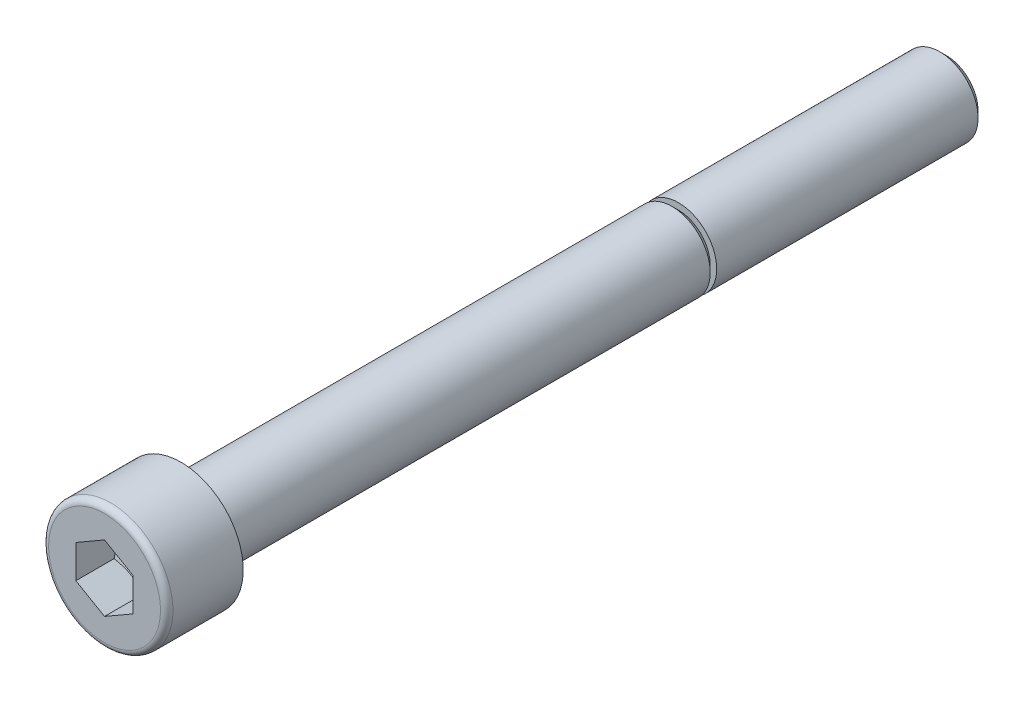
ISO-10303-21;
HEADER;
FILE_DESCRIPTION(('STEP AP214'),'2;1');
FILE_NAME('part.step','',(''),(''),'','','');
FILE_SCHEMA(('AUTOMOTIVE_DESIGN { 1 0 10303 214 1 1 1 1 }'));
ENDSEC;
DATA;
#1=APPLICATION_CONTEXT('core data for automotive mechanical design processes');
#2=APPLICATION_PROTOCOL_DEFINITION('international standard','automotive_design',2000,#1);
#3=PRODUCT_CONTEXT('',#1,'mechanical');
#4=PRODUCT('Part','Part','',(#3));
#5=PRODUCT_RELATED_PRODUCT_CATEGORY('part','',(#4));
#6=PRODUCT_DEFINITION_FORMATION('','',#4);
#7=PRODUCT_DEFINITION_CONTEXT('part definition',#1,'design');
#8=PRODUCT_DEFINITION('design','',#6,#7);
#9=PRODUCT_DEFINITION_SHAPE('','',#8);
#10=(LENGTH_UNIT() NAMED_UNIT(*) SI_UNIT(.MILLI.,.METRE.));
#11=(NAMED_UNIT(*) PLANE_ANGLE_UNIT() SI_UNIT($,.RADIAN.));
#12=(NAMED_UNIT(*) SI_UNIT($,.STERADIAN.) SOLID_ANGLE_UNIT());
#13=UNCERTAINTY_MEASURE_WITH_UNIT(LENGTH_MEASURE(1.E-05),#10,'distance_accuracy_value','');
#14=(GEOMETRIC_REPRESENTATION_CONTEXT(3) GLOBAL_UNCERTAINTY_ASSIGNED_CONTEXT((#13)) GLOBAL_UNIT_ASSIGNED_CONTEXT((#10,
#11,#12)) REPRESENTATION_CONTEXT('',''));
#15=CARTESIAN_POINT('',(0.,0.,0.));
#16=DIRECTION('',(0.,0.,1.));
#17=DIRECTION('',(1.,0.,0.));
#18=AXIS2_PLACEMENT_3D('',#15,#16,#17);
#19=CARTESIAN_POINT('',(-3.25,0.,0.));
#20=DIRECTION('',(0.,0.,-1.));
#21=DIRECTION('',(-1.,0.,0.));
#22=AXIS2_PLACEMENT_3D('',#19,#20,#21);
#23=PLANE('',#22);
#24=CARTESIAN_POINT('',(0.,0.,0.));
#25=DIRECTION('',(0.,0.,-1.));
#26=DIRECTION('',(-1.,0.,0.));
#27=AXIS2_PLACEMENT_3D('',#24,#25,#26);
#28=CIRCLE('',#27,6.5);
#29=CARTESIAN_POINT('',(-6.5,0.,0.));
#30=VERTEX_POINT('',#29);
#31=EDGE_CURVE('E9',#30,#30,#28,.T.);
#32=ORIENTED_EDGE('',*,*,#31,.T.);
#33=EDGE_LOOP('',(#32));
#34=FACE_BOUND('',#33,.T.);
#35=CARTESIAN_POINT('',(0.,0.,0.));
#36=DIRECTION('',(0.,0.,1.));
#37=DIRECTION('',(-1.,0.,0.));
#38=AXIS2_PLACEMENT_3D('',#35,#36,#37);
#39=CIRCLE('',#38,4.);
#40=CARTESIAN_POINT('',(4.,0.,0.));
#41=VERTEX_POINT('',#40);
#42=EDGE_CURVE('E131',#41,#41,#39,.T.);
#43=ORIENTED_EDGE('',*,*,#42,.T.);
#44=EDGE_LOOP('',(#43));
#45=FACE_BOUND('',#44,.T.);
#46=ADVANCED_FACE('F15',(#34,#45),#23,.T.);
#47=CARTESIAN_POINT('',(0.,0.,3.675));
#48=DIRECTION('',(0.,0.,1.));
#49=DIRECTION('',(-1.,0.,0.));
#50=AXIS2_PLACEMENT_3D('',#47,#48,#49);
#51=CYLINDRICAL_SURFACE('',#50,6.5);
#52=CARTESIAN_POINT('',(0.,0.,7.35));
#53=DIRECTION('',(0.,0.,-1.));
#54=DIRECTION('',(-1.,0.,0.));
#55=AXIS2_PLACEMENT_3D('',#52,#53,#54);
#56=CIRCLE('',#55,6.5);
#57=CARTESIAN_POINT('',(-6.5,0.,7.35));
#58=VERTEX_POINT('',#57);
#59=EDGE_CURVE('E25',#58,#58,#56,.T.);
#60=ORIENTED_EDGE('',*,*,#59,.T.);
#61=EDGE_LOOP('',(#60));
#62=FACE_BOUND('',#61,.T.);
#63=ORIENTED_EDGE('',*,*,#31,.F.);
#64=EDGE_LOOP('',(#63));
#65=FACE_BOUND('',#64,.T.);
#66=ADVANCED_FACE('F223',(#62,#65),#51,.T.);
#67=CARTESIAN_POINT('',(0.,0.,7.35));
#68=DIRECTION('',(0.,0.,-1.));
#69=DIRECTION('',(0.,-1.,0.));
#70=AXIS2_PLACEMENT_3D('',#67,#68,#69);
#71=TOROIDAL_SURFACE('',#70,5.85,0.65);
#72=CARTESIAN_POINT('',(0.,0.,8.));
#73=DIRECTION('',(0.,0.,-1.));
#74=DIRECTION('',(-1.,0.,0.));
#75=AXIS2_PLACEMENT_3D('',#72,#73,#74);
#76=CIRCLE('',#75,5.85);
#77=CARTESIAN_POINT('',(-5.85,0.,8.));
#78=VERTEX_POINT('',#77);
#79=EDGE_CURVE('E134',#78,#78,#76,.T.);
#80=ORIENTED_EDGE('',*,*,#79,.T.);
#81=EDGE_LOOP('',(#80));
#82=FACE_BOUND('',#81,.T.);
#83=ORIENTED_EDGE('',*,*,#59,.F.);
#84=EDGE_LOOP('',(#83));
#85=FACE_BOUND('',#84,.T.);
#86=ADVANCED_FACE('F228',(#82,#85),#71,.T.);
#87=CARTESIAN_POINT('',(-2.925,0.,8.));
#88=DIRECTION('',(0.,0.,1.));
#89=DIRECTION('',(1.,0.,0.));
#90=AXIS2_PLACEMENT_3D('',#87,#88,#89);
#91=PLANE('',#90);
#92=ORIENTED_EDGE('',*,*,#79,.F.);
#93=EDGE_LOOP('',(#92));
#94=FACE_BOUND('',#93,.T.);
#95=DIRECTION('',(-0.866025403784439,-0.5,0.));
#96=VECTOR('',#95,1.);
#97=CARTESIAN_POINT('',(0.403124300624837,-3.23135607651737,8.));
#98=LINE('',#97,#96);
#99=CARTESIAN_POINT('',(2.99999860124967,-1.73205,8.));
#100=VERTEX_POINT('',#99);
#101=CARTESIAN_POINT('',(0.,-3.4641,8.));
#102=VERTEX_POINT('',#101);
#103=EDGE_CURVE('E186',#100,#102,#98,.T.);
#104=ORIENTED_EDGE('',*,*,#103,.T.);
#105=DIRECTION('',(-0.866025403784439,0.5,0.));
#106=VECTOR('',#105,1.);
#107=CARTESIAN_POINT('',(-2.59687430062483,-1.96479392348263,8.));
#108=LINE('',#107,#106);
#109=CARTESIAN_POINT('',(-2.99999860124967,-1.73205,8.));
#110=VERTEX_POINT('',#109);
#111=EDGE_CURVE('E55',#102,#110,#108,.T.);
#112=ORIENTED_EDGE('',*,*,#111,.T.);
#113=DIRECTION('',(0.,1.,0.));
#114=VECTOR('',#113,1.);
#115=CARTESIAN_POINT('',(-2.99999860124967,0.,8.));
#116=LINE('',#115,#114);
#117=CARTESIAN_POINT('',(-2.99999860124967,1.73205,8.));
#118=VERTEX_POINT('',#117);
#119=EDGE_CURVE('E105',#110,#118,#116,.T.);
#120=ORIENTED_EDGE('',*,*,#119,.T.);
#121=DIRECTION('',(0.866025403784439,0.5,0.));
#122=VECTOR('',#121,1.);
#123=CARTESIAN_POINT('',(-2.59687430062483,1.96479392348263,8.));
#124=LINE('',#123,#122);
#125=CARTESIAN_POINT('',(0.,3.4641,8.));
#126=VERTEX_POINT('',#125);
#127=EDGE_CURVE('E163',#118,#126,#124,.T.);
#128=ORIENTED_EDGE('',*,*,#127,.T.);
#129=DIRECTION('',(0.866025403784439,-0.5,0.));
#130=VECTOR('',#129,1.);
#131=CARTESIAN_POINT('',(0.403124300624837,3.23135607651737,8.));
#132=LINE('',#131,#130);
#133=CARTESIAN_POINT('',(2.99999860124967,1.73205,8.));
#134=VERTEX_POINT('',#133);
#135=EDGE_CURVE('E160',#126,#134,#132,.T.);
#136=ORIENTED_EDGE('',*,*,#135,.T.);
#137=DIRECTION('',(0.,-1.,0.));
#138=VECTOR('',#137,1.);
#139=CARTESIAN_POINT('',(2.99999860124967,0.,8.));
#140=LINE('',#139,#138);
#141=EDGE_CURVE('E44',#134,#100,#140,.T.);
#142=ORIENTED_EDGE('',*,*,#141,.T.);
#143=EDGE_LOOP('',(#104,#112,#120,#128,#136,#142));
#144=FACE_BOUND('',#143,.T.);
#145=ADVANCED_FACE('F200',(#94,#144),#91,.T.);
#146=CARTESIAN_POINT('',(-1.66171875,0.,-80.));
#147=DIRECTION('',(0.,0.,-1.));
#148=DIRECTION('',(-1.,0.,0.));
#149=AXIS2_PLACEMENT_3D('',#146,#147,#148);
#150=PLANE('',#149);
#151=CARTESIAN_POINT('',(0.,0.,-80.));
#152=DIRECTION('',(0.,0.,-1.));
#153=DIRECTION('',(-1.,0.,0.));
#154=AXIS2_PLACEMENT_3D('',#151,#152,#153);
#155=CIRCLE('',#154,3.3234375);
#156=CARTESIAN_POINT('',(-3.3234375,0.,-80.));
#157=VERTEX_POINT('',#156);
#158=EDGE_CURVE('E132',#157,#157,#155,.T.);
#159=ORIENTED_EDGE('',*,*,#158,.T.);
#160=EDGE_LOOP('',(#159));
#161=FACE_BOUND('',#160,.T.);
#162=ADVANCED_FACE('F246',(#161),#150,.T.);
#163=CARTESIAN_POINT('',(0.,0.,-79.66171875));
#164=DIRECTION('',(0.,0.,1.));
#165=DIRECTION('',(-1.,0.,0.));
#166=AXIS2_PLACEMENT_3D('',#163,#164,#165);
#167=CONICAL_SURFACE('',#166,3.66171875,0.785398163397446);
#168=CARTESIAN_POINT('',(0.,0.,-79.3234375));
#169=DIRECTION('',(0.,0.,-1.));
#170=DIRECTION('',(-1.,0.,0.));
#171=AXIS2_PLACEMENT_3D('',#168,#169,#170);
#172=CIRCLE('',#171,4.);
#173=CARTESIAN_POINT('',(-4.,0.,-79.3234375));
#174=VERTEX_POINT('',#173);
#175=EDGE_CURVE('E135',#174,#174,#172,.T.);
#176=ORIENTED_EDGE('',*,*,#175,.T.);
#177=EDGE_LOOP('',(#176));
#178=FACE_BOUND('',#177,.T.);
#179=ORIENTED_EDGE('',*,*,#158,.F.);
#180=EDGE_LOOP('',(#179));
#181=FACE_BOUND('',#180,.T.);
#182=ADVANCED_FACE('F243',(#178,#181),#167,.T.);
#183=CARTESIAN_POINT('',(0.,0.,-65.66171875));
#184=DIRECTION('',(0.,0.,1.));
#185=DIRECTION('',(-1.,0.,0.));
#186=AXIS2_PLACEMENT_3D('',#183,#184,#185);
#187=CYLINDRICAL_SURFACE('',#186,4.);
#188=CARTESIAN_POINT('',(0.,0.,-52.));
#189=DIRECTION('',(0.,0.,-1.));
#190=DIRECTION('',(-1.,0.,0.));
#191=AXIS2_PLACEMENT_3D('',#188,#189,#190);
#192=CIRCLE('',#191,4.);
#193=CARTESIAN_POINT('',(-4.,0.,-52.));
#194=VERTEX_POINT('',#193);
#195=EDGE_CURVE('E184',#194,#194,#192,.T.);
#196=ORIENTED_EDGE('',*,*,#195,.T.);
#197=EDGE_LOOP('',(#196));
#198=FACE_BOUND('',#197,.T.);
#199=ORIENTED_EDGE('',*,*,#175,.F.);
#200=EDGE_LOOP('',(#199));
#201=FACE_BOUND('',#200,.T.);
#202=ADVANCED_FACE('F17',(#198,#201),#187,.T.);
#203=CARTESIAN_POINT('',(-3.66171875,0.,-52.));
#204=DIRECTION('',(0.,0.,1.));
#205=DIRECTION('',(1.,0.,0.));
#206=AXIS2_PLACEMENT_3D('',#203,#204,#205);
#207=PLANE('',#206);
#208=CARTESIAN_POINT('',(0.,0.,-52.));
#209=DIRECTION('',(0.,0.,-1.));
#210=DIRECTION('',(-1.,0.,0.));
#211=AXIS2_PLACEMENT_3D('',#208,#209,#210);
#212=CIRCLE('',#211,3.3234375);
#213=CARTESIAN_POINT('',(-3.3234375,0.,-52.));
#214=VERTEX_POINT('',#213);
#215=EDGE_CURVE('E187',#214,#214,#212,.T.);
#216=ORIENTED_EDGE('',*,*,#215,.T.);
#217=EDGE_LOOP('',(#216));
#218=FACE_BOUND('',#217,.T.);
#219=ORIENTED_EDGE('',*,*,#195,.F.);
#220=EDGE_LOOP('',(#219));
#221=FACE_BOUND('',#220,.T.);
#222=ADVANCED_FACE('F233',(#218,#221),#207,.T.);
#223=CARTESIAN_POINT('',(0.,0.,-51.66171875));
#224=DIRECTION('',(0.,0.,1.));
#225=DIRECTION('',(-1.,0.,0.));
#226=AXIS2_PLACEMENT_3D('',#223,#224,#225);
#227=CONICAL_SURFACE('',#226,3.66171875,0.785398163397446);
#228=CARTESIAN_POINT('',(0.,0.,-51.3234375));
#229=DIRECTION('',(0.,0.,-1.));
#230=DIRECTION('',(-1.,0.,0.));
#231=AXIS2_PLACEMENT_3D('',#228,#229,#230);
#232=CIRCLE('',#231,4.);
#233=CARTESIAN_POINT('',(-4.,0.,-51.3234375));
#234=VERTEX_POINT('',#233);
#235=EDGE_CURVE('E126',#234,#234,#232,.T.);
#236=ORIENTED_EDGE('',*,*,#235,.T.);
#237=EDGE_LOOP('',(#236));
#238=FACE_BOUND('',#237,.T.);
#239=ORIENTED_EDGE('',*,*,#215,.F.);
#240=EDGE_LOOP('',(#239));
#241=FACE_BOUND('',#240,.T.);
#242=ADVANCED_FACE('F241',(#238,#241),#227,.T.);
#243=CARTESIAN_POINT('',(0.,0.,-25.16171875));
#244=DIRECTION('',(0.,0.,1.));
#245=DIRECTION('',(-1.,0.,0.));
#246=AXIS2_PLACEMENT_3D('',#243,#244,#245);
#247=CYLINDRICAL_SURFACE('',#246,4.);
#248=ORIENTED_EDGE('',*,*,#42,.F.);
#249=EDGE_LOOP('',(#248));
#250=FACE_BOUND('',#249,.T.);
#251=ORIENTED_EDGE('',*,*,#235,.F.);
#252=EDGE_LOOP('',(#251));
#253=FACE_BOUND('',#252,.T.);
#254=ADVANCED_FACE('F236',(#250,#253),#247,.T.);
#255=CARTESIAN_POINT('',(-1.49999930062484,-2.598075,8.));
#256=DIRECTION('',(-0.5,-0.866025403784439,0.));
#257=DIRECTION('',(-0.866025403784439,0.5,0.));
#258=AXIS2_PLACEMENT_3D('',#255,#256,#257);
#259=PLANE('',#258);
#260=CARTESIAN_POINT('',(0.,-3.4641,4.));
#261=CARTESIAN_POINT('',(-1.49999930062483,-2.598075,3.50000023312505));
#262=CARTESIAN_POINT('',(-2.99999860124967,-1.73205,4.));
#263=(BOUNDED_CURVE() B_SPLINE_CURVE(2,(#260,#261,#262),.UNSPECIFIED.,.F.,
.F.) B_SPLINE_CURVE_WITH_KNOTS((3,3),(0.,3.50530677988333),
.UNSPECIFIED.) CURVE() GEOMETRIC_REPRESENTATION_ITEM() RATIONAL_B_SPLINE_CURVE((1.,
1.15470053837925,1.)) REPRESENTATION_ITEM(''));
#264=CARTESIAN_POINT('',(0.,-3.4641,4.));
#265=VERTEX_POINT('',#264);
#266=CARTESIAN_POINT('',(-2.99999860124967,-1.73205,4.));
#267=VERTEX_POINT('',#266);
#268=EDGE_CURVE('E108',#265,#267,#263,.T.);
#269=ORIENTED_EDGE('',*,*,#268,.T.);
#270=DIRECTION('',(0.,0.,-1.));
#271=VECTOR('',#270,1.);
#272=CARTESIAN_POINT('',(-2.99999860124967,-1.73205,8.));
#273=LINE('',#272,#271);
#274=EDGE_CURVE('E98',#110,#267,#273,.T.);
#275=ORIENTED_EDGE('',*,*,#274,.F.);
#276=ORIENTED_EDGE('',*,*,#111,.F.);
#277=DIRECTION('',(0.,0.,-1.));
#278=VECTOR('',#277,1.);
#279=CARTESIAN_POINT('',(0.,-3.4641,8.));
#280=LINE('',#279,#278);
#281=EDGE_CURVE('E19',#102,#265,#280,.T.);
#282=ORIENTED_EDGE('',*,*,#281,.T.);
#283=EDGE_LOOP('',(#269,#275,#276,#282));
#284=FACE_BOUND('',#283,.T.);
#285=ADVANCED_FACE('F109',(#284),#259,.F.);
#286=CARTESIAN_POINT('',(-2.99999860124967,0.,8.));
#287=DIRECTION('',(-1.,0.,0.));
#288=DIRECTION('',(0.,1.,0.));
#289=AXIS2_PLACEMENT_3D('',#286,#287,#288);
#290=PLANE('',#289);
#291=CARTESIAN_POINT('',(-2.99999860124967,-1.73205,4.));
#292=CARTESIAN_POINT('',(-2.99999860124967,0.,3.50000023312505));
#293=CARTESIAN_POINT('',(-2.99999860124967,1.73205,4.));
#294=(BOUNDED_CURVE() B_SPLINE_CURVE(2,(#291,#292,#293),.UNSPECIFIED.,.F.,
.F.) B_SPLINE_CURVE_WITH_KNOTS((3,3),(0.,3.50530677988333),
.UNSPECIFIED.) CURVE() GEOMETRIC_REPRESENTATION_ITEM() RATIONAL_B_SPLINE_CURVE((1.,
1.15470053837925,1.)) REPRESENTATION_ITEM(''));
#295=CARTESIAN_POINT('',(-2.99999860124967,1.73205,4.));
#296=VERTEX_POINT('',#295);
#297=EDGE_CURVE('E103',#267,#296,#294,.T.);
#298=ORIENTED_EDGE('',*,*,#297,.T.);
#299=DIRECTION('',(0.,0.,-1.));
#300=VECTOR('',#299,1.);
#301=CARTESIAN_POINT('',(-2.99999860124967,1.73205,8.));
#302=LINE('',#301,#300);
#303=EDGE_CURVE('E165',#118,#296,#302,.T.);
#304=ORIENTED_EDGE('',*,*,#303,.F.);
#305=ORIENTED_EDGE('',*,*,#119,.F.);
#306=ORIENTED_EDGE('',*,*,#274,.T.);
#307=EDGE_LOOP('',(#298,#304,#305,#306));
#308=FACE_BOUND('',#307,.T.);
#309=ADVANCED_FACE('F100',(#308),#290,.F.);
#310=CARTESIAN_POINT('',(-1.49999930062484,2.598075,8.));
#311=DIRECTION('',(-0.5,0.866025403784439,0.));
#312=DIRECTION('',(0.866025403784439,0.5,0.));
#313=AXIS2_PLACEMENT_3D('',#310,#311,#312);
#314=PLANE('',#313);
#315=CARTESIAN_POINT('',(-2.99999860124967,1.73205,4.));
#316=CARTESIAN_POINT('',(-1.49999930062484,2.598075,3.50000023312506));
#317=CARTESIAN_POINT('',(0.,3.4641,4.));
#318=(BOUNDED_CURVE() B_SPLINE_CURVE(2,(#315,#316,#317),.UNSPECIFIED.,.F.,
.F.) B_SPLINE_CURVE_WITH_KNOTS((3,3),(0.,3.50530677988333),
.UNSPECIFIED.) CURVE() GEOMETRIC_REPRESENTATION_ITEM() RATIONAL_B_SPLINE_CURVE((1.,
1.15470053837925,1.)) REPRESENTATION_ITEM(''));
#319=CARTESIAN_POINT('',(0.,3.4641,4.));
#320=VERTEX_POINT('',#319);
#321=EDGE_CURVE('E119',#296,#320,#318,.T.);
#322=ORIENTED_EDGE('',*,*,#321,.T.);
#323=DIRECTION('',(0.,0.,-1.));
#324=VECTOR('',#323,1.);
#325=CARTESIAN_POINT('',(0.,3.4641,8.));
#326=LINE('',#325,#324);
#327=EDGE_CURVE('E161',#126,#320,#326,.T.);
#328=ORIENTED_EDGE('',*,*,#327,.F.);
#329=ORIENTED_EDGE('',*,*,#127,.F.);
#330=ORIENTED_EDGE('',*,*,#303,.T.);
#331=EDGE_LOOP('',(#322,#328,#329,#330));
#332=FACE_BOUND('',#331,.T.);
#333=ADVANCED_FACE('F212',(#332),#314,.F.);
#334=CARTESIAN_POINT('',(1.49999930062484,2.598075,8.));
#335=DIRECTION('',(0.5,0.866025403784439,0.));
#336=DIRECTION('',(0.866025403784439,-0.5,0.));
#337=AXIS2_PLACEMENT_3D('',#334,#335,#336);
#338=PLANE('',#337);
#339=CARTESIAN_POINT('',(0.,3.4641,4.));
#340=CARTESIAN_POINT('',(1.49999930062484,2.598075,3.50000023312505));
#341=CARTESIAN_POINT('',(2.99999860124967,1.73205,4.));
#342=(BOUNDED_CURVE() B_SPLINE_CURVE(2,(#339,#340,#341),.UNSPECIFIED.,.F.,
.F.) B_SPLINE_CURVE_WITH_KNOTS((3,3),(0.,3.50530677988332),
.UNSPECIFIED.) CURVE() GEOMETRIC_REPRESENTATION_ITEM() RATIONAL_B_SPLINE_CURVE((1.,
1.15470053837925,1.)) REPRESENTATION_ITEM(''));
#343=CARTESIAN_POINT('',(2.99999860124967,1.73205,4.));
#344=VERTEX_POINT('',#343);
#345=EDGE_CURVE('E141',#320,#344,#342,.T.);
#346=ORIENTED_EDGE('',*,*,#345,.T.);
#347=DIRECTION('',(0.,0.,-1.));
#348=VECTOR('',#347,1.);
#349=CARTESIAN_POINT('',(2.99999860124967,1.73205,8.));
#350=LINE('',#349,#348);
#351=EDGE_CURVE('E155',#134,#344,#350,.T.);
#352=ORIENTED_EDGE('',*,*,#351,.F.);
#353=ORIENTED_EDGE('',*,*,#135,.F.);
#354=ORIENTED_EDGE('',*,*,#327,.T.);
#355=EDGE_LOOP('',(#346,#352,#353,#354));
#356=FACE_BOUND('',#355,.T.);
#357=ADVANCED_FACE('F204',(#356),#338,.F.);
#358=CARTESIAN_POINT('',(2.99999860124967,0.,8.));
#359=DIRECTION('',(1.,0.,0.));
#360=DIRECTION('',(0.,-1.,0.));
#361=AXIS2_PLACEMENT_3D('',#358,#359,#360);
#362=PLANE('',#361);
#363=CARTESIAN_POINT('',(2.99999860124967,1.73205,4.));
#364=CARTESIAN_POINT('',(2.99999860124969,0.,3.50000023312506));
#365=CARTESIAN_POINT('',(2.99999860124967,-1.73205,4.));
#366=(BOUNDED_CURVE() B_SPLINE_CURVE(2,(#363,#364,#365),.UNSPECIFIED.,.F.,
.F.) B_SPLINE_CURVE_WITH_KNOTS((3,3),(0.,3.50530677988333),
.UNSPECIFIED.) CURVE() GEOMETRIC_REPRESENTATION_ITEM() RATIONAL_B_SPLINE_CURVE((1.,
1.15470053837924,1.)) REPRESENTATION_ITEM(''));
#367=CARTESIAN_POINT('',(2.99999860124967,-1.73205,4.));
#368=VERTEX_POINT('',#367);
#369=EDGE_CURVE('E136',#344,#368,#366,.T.);
#370=ORIENTED_EDGE('',*,*,#369,.T.);
#371=DIRECTION('',(0.,0.,-1.));
#372=VECTOR('',#371,1.);
#373=CARTESIAN_POINT('',(2.99999860124967,-1.73205,8.));
#374=LINE('',#373,#372);
#375=EDGE_CURVE('E185',#100,#368,#374,.T.);
#376=ORIENTED_EDGE('',*,*,#375,.F.);
#377=ORIENTED_EDGE('',*,*,#141,.F.);
#378=ORIENTED_EDGE('',*,*,#351,.T.);
#379=EDGE_LOOP('',(#370,#376,#377,#378));
#380=FACE_BOUND('',#379,.T.);
#381=ADVANCED_FACE('F207',(#380),#362,.F.);
#382=CARTESIAN_POINT('',(1.49999930062484,-2.598075,8.));
#383=DIRECTION('',(0.5,-0.866025403784439,0.));
#384=DIRECTION('',(-0.866025403784439,-0.5,0.));
#385=AXIS2_PLACEMENT_3D('',#382,#383,#384);
#386=PLANE('',#385);
#387=CARTESIAN_POINT('',(2.99999860124967,-1.73205,4.));
#388=CARTESIAN_POINT('',(1.49999930062485,-2.598075,3.50000023312506));
#389=CARTESIAN_POINT('',(0.,-3.4641,4.));
#390=(BOUNDED_CURVE() B_SPLINE_CURVE(2,(#387,#388,#389),.UNSPECIFIED.,.F.,
.F.) B_SPLINE_CURVE_WITH_KNOTS((3,3),(0.,3.50530677988333),
.UNSPECIFIED.) CURVE() GEOMETRIC_REPRESENTATION_ITEM() RATIONAL_B_SPLINE_CURVE((1.,
1.15470053837924,1.)) REPRESENTATION_ITEM(''));
#391=EDGE_CURVE('E114',#368,#265,#390,.T.);
#392=ORIENTED_EDGE('',*,*,#391,.T.);
#393=ORIENTED_EDGE('',*,*,#281,.F.);
#394=ORIENTED_EDGE('',*,*,#103,.F.);
#395=ORIENTED_EDGE('',*,*,#375,.T.);
#396=EDGE_LOOP('',(#392,#393,#394,#395));
#397=FACE_BOUND('',#396,.T.);
#398=ADVANCED_FACE('F210',(#397),#386,.F.);
#399=CARTESIAN_POINT('',(0.,0.,3.00000046625011));
#400=DIRECTION('',(0.,0.,1.));
#401=DIRECTION('',(-1.,0.,0.));
#402=AXIS2_PLACEMENT_3D('',#399,#400,#401);
#403=CONICAL_SURFACE('',#402,1.73205,1.0471975511966);
#404=CARTESIAN_POINT('',(0.,0.,2.00000093250022));
#405=VERTEX_POINT('',#404);
#406=VERTEX_LOOP('',#405);
#407=FACE_BOUND('',#406,.T.);
#408=ORIENTED_EDGE('',*,*,#321,.F.);
#409=ORIENTED_EDGE('',*,*,#297,.F.);
#410=ORIENTED_EDGE('',*,*,#268,.F.);
#411=ORIENTED_EDGE('',*,*,#391,.F.);
#412=ORIENTED_EDGE('',*,*,#369,.F.);
#413=ORIENTED_EDGE('',*,*,#345,.F.);
#414=EDGE_LOOP('',(#408,#409,#410,#411,#412,#413));
#415=FACE_BOUND('',#414,.T.);
#416=ADVANCED_FACE('F116',(#407,#415),#403,.F.);
#417=CLOSED_SHELL('',(#46,#66,#86,#145,#162,#182,#202,#222,#242,#254,#285,#309,#333,#357,#381,
#398,#416));
#418=MANIFOLD_SOLID_BREP('B1',#417);
#419=ADVANCED_BREP_SHAPE_REPRESENTATION('',(#18,#418),#14);
#420=SHAPE_DEFINITION_REPRESENTATION(#9,#419);
ENDSEC;
END-ISO-10303-21;
